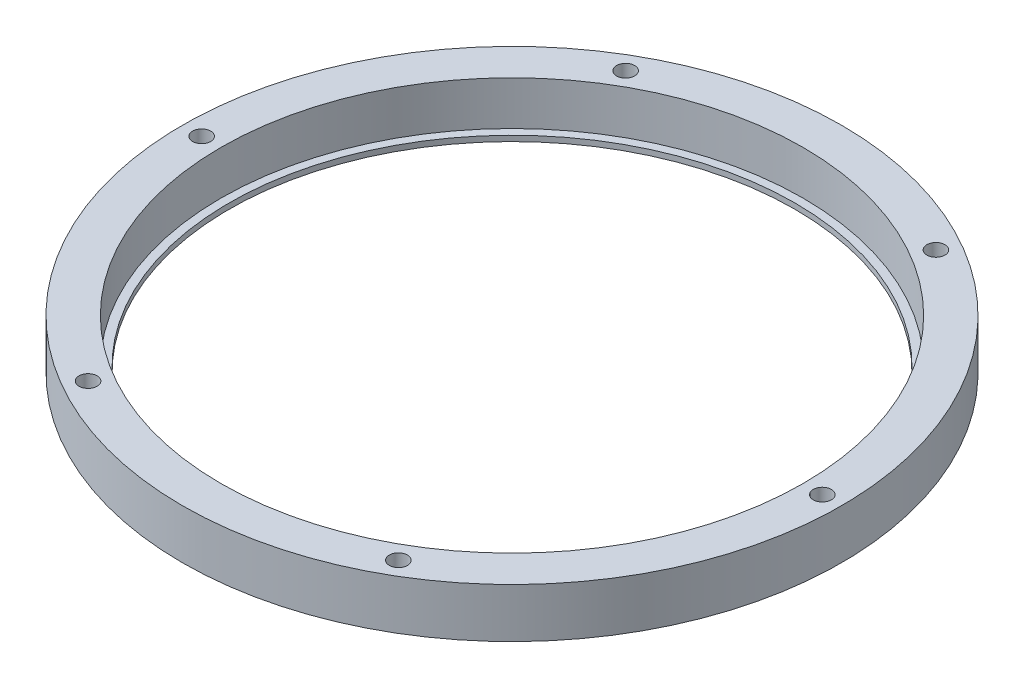
ISO-10303-21;
HEADER;
FILE_DESCRIPTION(('STEP AP214'),'2;1');
FILE_NAME('part.step','',(''),(''),'','','');
FILE_SCHEMA(('AUTOMOTIVE_DESIGN { 1 0 10303 214 1 1 1 1 }'));
ENDSEC;
DATA;
#1=APPLICATION_CONTEXT('core data for automotive mechanical design processes');
#2=APPLICATION_PROTOCOL_DEFINITION('international standard','automotive_design',2000,#1);
#3=PRODUCT_CONTEXT('',#1,'mechanical');
#4=PRODUCT('Part','Part','',(#3));
#5=PRODUCT_RELATED_PRODUCT_CATEGORY('part','',(#4));
#6=PRODUCT_DEFINITION_FORMATION('','',#4);
#7=PRODUCT_DEFINITION_CONTEXT('part definition',#1,'design');
#8=PRODUCT_DEFINITION('design','',#6,#7);
#9=PRODUCT_DEFINITION_SHAPE('','',#8);
#10=(LENGTH_UNIT() NAMED_UNIT(*) SI_UNIT(.MILLI.,.METRE.));
#11=(NAMED_UNIT(*) PLANE_ANGLE_UNIT() SI_UNIT($,.RADIAN.));
#12=(NAMED_UNIT(*) SI_UNIT($,.STERADIAN.) SOLID_ANGLE_UNIT());
#13=UNCERTAINTY_MEASURE_WITH_UNIT(LENGTH_MEASURE(1.E-05),#10,'distance_accuracy_value','');
#14=(GEOMETRIC_REPRESENTATION_CONTEXT(3) GLOBAL_UNCERTAINTY_ASSIGNED_CONTEXT((#13)) GLOBAL_UNIT_ASSIGNED_CONTEXT((#10,
#11,#12)) REPRESENTATION_CONTEXT('',''));
#15=CARTESIAN_POINT('',(0.,0.,0.));
#16=DIRECTION('',(0.,0.,1.));
#17=DIRECTION('',(1.,0.,0.));
#18=AXIS2_PLACEMENT_3D('',#15,#16,#17);
#19=CARTESIAN_POINT('',(0.,8.,0.));
#20=DIRECTION('',(0.,1.,0.));
#21=DIRECTION('',(0.,0.,1.));
#22=AXIS2_PLACEMENT_3D('',#19,#20,#21);
#23=PLANE('',#22);
#24=CARTESIAN_POINT('',(-28.25,8.,-48.9304353138208));
#25=DIRECTION('',(0.,1.,0.));
#26=DIRECTION('',(0.,0.,1.));
#27=AXIS2_PLACEMENT_3D('',#24,#25,#26);
#28=CIRCLE('',#27,1.64999999999999);
#29=CARTESIAN_POINT('',(-28.25,8.,-47.2804353138208));
#30=VERTEX_POINT('',#29);
#31=EDGE_CURVE('E93',#30,#30,#28,.T.);
#32=ORIENTED_EDGE('',*,*,#31,.F.);
#33=EDGE_LOOP('',(#32));
#34=FACE_BOUND('',#33,.T.);
#35=CARTESIAN_POINT('',(28.25,8.,-48.9304353138208));
#36=DIRECTION('',(0.,1.,0.));
#37=DIRECTION('',(0.,0.,1.));
#38=AXIS2_PLACEMENT_3D('',#35,#36,#37);
#39=CIRCLE('',#38,1.64999999999999);
#40=CARTESIAN_POINT('',(28.25,8.,-47.2804353138208));
#41=VERTEX_POINT('',#40);
#42=EDGE_CURVE('E87',#41,#41,#39,.T.);
#43=ORIENTED_EDGE('',*,*,#42,.F.);
#44=EDGE_LOOP('',(#43));
#45=FACE_BOUND('',#44,.T.);
#46=CARTESIAN_POINT('',(56.5,8.,0.));
#47=DIRECTION('',(0.,1.,0.));
#48=DIRECTION('',(0.,0.,1.));
#49=AXIS2_PLACEMENT_3D('',#46,#47,#48);
#50=CIRCLE('',#49,1.64999999999998);
#51=CARTESIAN_POINT('',(56.5,8.,1.64999999999998));
#52=VERTEX_POINT('',#51);
#53=EDGE_CURVE('E81',#52,#52,#50,.T.);
#54=ORIENTED_EDGE('',*,*,#53,.F.);
#55=EDGE_LOOP('',(#54));
#56=FACE_BOUND('',#55,.T.);
#57=CARTESIAN_POINT('',(28.25,8.,48.9304353138208));
#58=DIRECTION('',(0.,1.,0.));
#59=DIRECTION('',(0.,0.,1.));
#60=AXIS2_PLACEMENT_3D('',#57,#58,#59);
#61=CIRCLE('',#60,1.64999999999999);
#62=CARTESIAN_POINT('',(28.25,8.,50.5804353138208));
#63=VERTEX_POINT('',#62);
#64=EDGE_CURVE('E75',#63,#63,#61,.T.);
#65=ORIENTED_EDGE('',*,*,#64,.F.);
#66=EDGE_LOOP('',(#65));
#67=FACE_BOUND('',#66,.T.);
#68=CARTESIAN_POINT('',(-28.25,8.,48.9304353138208));
#69=DIRECTION('',(0.,1.,0.));
#70=DIRECTION('',(0.,0.,1.));
#71=AXIS2_PLACEMENT_3D('',#68,#69,#70);
#72=CIRCLE('',#71,1.64999999999999);
#73=CARTESIAN_POINT('',(-28.25,8.,50.5804353138208));
#74=VERTEX_POINT('',#73);
#75=EDGE_CURVE('E69',#74,#74,#72,.T.);
#76=ORIENTED_EDGE('',*,*,#75,.F.);
#77=EDGE_LOOP('',(#76));
#78=FACE_BOUND('',#77,.T.);
#79=CARTESIAN_POINT('',(-56.5,8.,0.));
#80=DIRECTION('',(0.,1.,0.));
#81=DIRECTION('',(0.,0.,1.));
#82=AXIS2_PLACEMENT_3D('',#79,#80,#81);
#83=CIRCLE('',#82,1.64999999999998);
#84=CARTESIAN_POINT('',(-56.5,8.,1.64999999999997));
#85=VERTEX_POINT('',#84);
#86=EDGE_CURVE('E63',#85,#85,#83,.T.);
#87=ORIENTED_EDGE('',*,*,#86,.F.);
#88=EDGE_LOOP('',(#87));
#89=FACE_BOUND('',#88,.T.);
#90=CARTESIAN_POINT('',(0.,8.,0.));
#91=DIRECTION('',(0.,1.,0.));
#92=DIRECTION('',(0.,0.,1.));
#93=AXIS2_PLACEMENT_3D('',#90,#91,#92);
#94=CIRCLE('',#93,60.);
#95=CARTESIAN_POINT('',(0.,8.,60.));
#96=VERTEX_POINT('',#95);
#97=EDGE_CURVE('E10',#96,#96,#94,.T.);
#98=ORIENTED_EDGE('',*,*,#97,.T.);
#99=EDGE_LOOP('',(#98));
#100=FACE_BOUND('',#99,.T.);
#101=CARTESIAN_POINT('',(0.,8.,0.));
#102=DIRECTION('',(0.,1.,0.));
#103=DIRECTION('',(0.,0.,1.));
#104=AXIS2_PLACEMENT_3D('',#101,#102,#103);
#105=CIRCLE('',#104,53.);
#106=CARTESIAN_POINT('',(0.,8.,53.));
#107=VERTEX_POINT('',#106);
#108=EDGE_CURVE('E41',#107,#107,#105,.T.);
#109=ORIENTED_EDGE('',*,*,#108,.F.);
#110=EDGE_LOOP('',(#109));
#111=FACE_BOUND('',#110,.T.);
#112=ADVANCED_FACE('F34',(#34,#45,#56,#67,#78,#89,#100,#111),#23,.T.);
#113=CARTESIAN_POINT('',(0.,8.,0.));
#114=DIRECTION('',(0.,-1.,0.));
#115=DIRECTION('',(0.,0.,-1.));
#116=AXIS2_PLACEMENT_3D('',#113,#114,#115);
#117=CYLINDRICAL_SURFACE('',#116,60.);
#118=ORIENTED_EDGE('',*,*,#97,.F.);
#119=EDGE_LOOP('',(#118));
#120=FACE_BOUND('',#119,.T.);
#121=CARTESIAN_POINT('',(0.,-1.,0.));
#122=DIRECTION('',(0.,-1.,0.));
#123=DIRECTION('',(0.,0.,-1.));
#124=AXIS2_PLACEMENT_3D('',#121,#122,#123);
#125=CIRCLE('',#124,60.);
#126=CARTESIAN_POINT('',(0.,-1.,-60.));
#127=VERTEX_POINT('',#126);
#128=EDGE_CURVE('E50',#127,#127,#125,.T.);
#129=ORIENTED_EDGE('',*,*,#128,.F.);
#130=EDGE_LOOP('',(#129));
#131=FACE_BOUND('',#130,.T.);
#132=ADVANCED_FACE('F36',(#120,#131),#117,.T.);
#133=CARTESIAN_POINT('',(0.,8.,0.));
#134=DIRECTION('',(0.,-1.,0.));
#135=DIRECTION('',(0.,0.,-1.));
#136=AXIS2_PLACEMENT_3D('',#133,#134,#135);
#137=CYLINDRICAL_SURFACE('',#136,53.);
#138=ORIENTED_EDGE('',*,*,#108,.T.);
#139=EDGE_LOOP('',(#138));
#140=FACE_BOUND('',#139,.T.);
#141=CARTESIAN_POINT('',(0.,0.,0.));
#142=DIRECTION('',(0.,1.,0.));
#143=DIRECTION('',(0.,0.,1.));
#144=AXIS2_PLACEMENT_3D('',#141,#142,#143);
#145=CIRCLE('',#144,53.);
#146=CARTESIAN_POINT('',(0.,0.,53.));
#147=VERTEX_POINT('',#146);
#148=EDGE_CURVE('E45',#147,#147,#145,.T.);
#149=ORIENTED_EDGE('',*,*,#148,.F.);
#150=EDGE_LOOP('',(#149));
#151=FACE_BOUND('',#150,.T.);
#152=ADVANCED_FACE('F137',(#140,#151),#137,.F.);
#153=CARTESIAN_POINT('',(0.,0.,0.));
#154=DIRECTION('',(0.,-1.,0.));
#155=DIRECTION('',(0.,0.,-1.));
#156=AXIS2_PLACEMENT_3D('',#153,#154,#155);
#157=PLANE('',#156);
#158=CARTESIAN_POINT('',(0.,0.,0.));
#159=DIRECTION('',(0.,-1.,0.));
#160=DIRECTION('',(0.,0.,-1.));
#161=AXIS2_PLACEMENT_3D('',#158,#159,#160);
#162=CIRCLE('',#161,51.5);
#163=CARTESIAN_POINT('',(0.,0.,-51.5));
#164=VERTEX_POINT('',#163);
#165=EDGE_CURVE('E55',#164,#164,#162,.T.);
#166=ORIENTED_EDGE('',*,*,#165,.T.);
#167=EDGE_LOOP('',(#166));
#168=FACE_BOUND('',#167,.T.);
#169=ORIENTED_EDGE('',*,*,#148,.T.);
#170=EDGE_LOOP('',(#169));
#171=FACE_BOUND('',#170,.T.);
#172=ADVANCED_FACE('F133',(#168,#171),#157,.F.);
#173=CARTESIAN_POINT('',(0.,-1.,0.));
#174=DIRECTION('',(0.,-1.,0.));
#175=DIRECTION('',(0.,0.,-1.));
#176=AXIS2_PLACEMENT_3D('',#173,#174,#175);
#177=PLANE('',#176);
#178=CARTESIAN_POINT('',(-28.25,-1.,-48.9304353138208));
#179=DIRECTION('',(0.,1.,0.));
#180=DIRECTION('',(0.,0.,1.));
#181=AXIS2_PLACEMENT_3D('',#178,#179,#180);
#182=CIRCLE('',#181,1.65);
#183=CARTESIAN_POINT('',(-28.25,-1.,-47.2804353138208));
#184=VERTEX_POINT('',#183);
#185=EDGE_CURVE('E90',#184,#184,#182,.T.);
#186=ORIENTED_EDGE('',*,*,#185,.T.);
#187=EDGE_LOOP('',(#186));
#188=FACE_BOUND('',#187,.T.);
#189=CARTESIAN_POINT('',(28.25,-1.,-48.9304353138208));
#190=DIRECTION('',(0.,1.,0.));
#191=DIRECTION('',(0.,0.,1.));
#192=AXIS2_PLACEMENT_3D('',#189,#190,#191);
#193=CIRCLE('',#192,1.65);
#194=CARTESIAN_POINT('',(28.25,-1.,-47.2804353138208));
#195=VERTEX_POINT('',#194);
#196=EDGE_CURVE('E84',#195,#195,#193,.T.);
#197=ORIENTED_EDGE('',*,*,#196,.T.);
#198=EDGE_LOOP('',(#197));
#199=FACE_BOUND('',#198,.T.);
#200=CARTESIAN_POINT('',(56.5,-1.,0.));
#201=DIRECTION('',(0.,1.,0.));
#202=DIRECTION('',(0.,0.,1.));
#203=AXIS2_PLACEMENT_3D('',#200,#201,#202);
#204=CIRCLE('',#203,1.65);
#205=CARTESIAN_POINT('',(56.5,-1.,1.65));
#206=VERTEX_POINT('',#205);
#207=EDGE_CURVE('E78',#206,#206,#204,.T.);
#208=ORIENTED_EDGE('',*,*,#207,.T.);
#209=EDGE_LOOP('',(#208));
#210=FACE_BOUND('',#209,.T.);
#211=CARTESIAN_POINT('',(28.25,-1.,48.9304353138208));
#212=DIRECTION('',(0.,1.,0.));
#213=DIRECTION('',(0.,0.,1.));
#214=AXIS2_PLACEMENT_3D('',#211,#212,#213);
#215=CIRCLE('',#214,1.65);
#216=CARTESIAN_POINT('',(28.25,-1.,50.5804353138208));
#217=VERTEX_POINT('',#216);
#218=EDGE_CURVE('E72',#217,#217,#215,.T.);
#219=ORIENTED_EDGE('',*,*,#218,.T.);
#220=EDGE_LOOP('',(#219));
#221=FACE_BOUND('',#220,.T.);
#222=CARTESIAN_POINT('',(-28.25,-1.,48.9304353138208));
#223=DIRECTION('',(0.,1.,0.));
#224=DIRECTION('',(0.,0.,1.));
#225=AXIS2_PLACEMENT_3D('',#222,#223,#224);
#226=CIRCLE('',#225,1.65);
#227=CARTESIAN_POINT('',(-28.25,-1.,50.5804353138208));
#228=VERTEX_POINT('',#227);
#229=EDGE_CURVE('E66',#228,#228,#226,.T.);
#230=ORIENTED_EDGE('',*,*,#229,.T.);
#231=EDGE_LOOP('',(#230));
#232=FACE_BOUND('',#231,.T.);
#233=CARTESIAN_POINT('',(-56.5,-1.,0.));
#234=DIRECTION('',(0.,1.,0.));
#235=DIRECTION('',(0.,0.,1.));
#236=AXIS2_PLACEMENT_3D('',#233,#234,#235);
#237=CIRCLE('',#236,1.65);
#238=CARTESIAN_POINT('',(-56.5,-1.,1.64999999999998));
#239=VERTEX_POINT('',#238);
#240=EDGE_CURVE('E58',#239,#239,#237,.T.);
#241=ORIENTED_EDGE('',*,*,#240,.T.);
#242=EDGE_LOOP('',(#241));
#243=FACE_BOUND('',#242,.T.);
#244=ORIENTED_EDGE('',*,*,#128,.T.);
#245=EDGE_LOOP('',(#244));
#246=FACE_BOUND('',#245,.T.);
#247=CARTESIAN_POINT('',(0.,-1.,0.));
#248=DIRECTION('',(0.,-1.,0.));
#249=DIRECTION('',(0.,0.,-1.));
#250=AXIS2_PLACEMENT_3D('',#247,#248,#249);
#251=CIRCLE('',#250,51.5);
#252=CARTESIAN_POINT('',(0.,-1.,-51.5));
#253=VERTEX_POINT('',#252);
#254=EDGE_CURVE('E54',#253,#253,#251,.T.);
#255=ORIENTED_EDGE('',*,*,#254,.F.);
#256=EDGE_LOOP('',(#255));
#257=FACE_BOUND('',#256,.T.);
#258=ADVANCED_FACE('F125',(#188,#199,#210,#221,#232,#243,#246,#257),#177,.T.);
#259=CARTESIAN_POINT('',(0.,-1.,0.));
#260=DIRECTION('',(0.,1.,0.));
#261=DIRECTION('',(0.,0.,1.));
#262=AXIS2_PLACEMENT_3D('',#259,#260,#261);
#263=CYLINDRICAL_SURFACE('',#262,51.5);
#264=ORIENTED_EDGE('',*,*,#254,.T.);
#265=EDGE_LOOP('',(#264));
#266=FACE_BOUND('',#265,.T.);
#267=ORIENTED_EDGE('',*,*,#165,.F.);
#268=EDGE_LOOP('',(#267));
#269=FACE_BOUND('',#268,.T.);
#270=ADVANCED_FACE('F115',(#266,#269),#263,.F.);
#271=CARTESIAN_POINT('',(-56.5,8.,0.));
#272=DIRECTION('',(0.,1.,0.));
#273=DIRECTION('',(0.,0.,1.));
#274=AXIS2_PLACEMENT_3D('',#271,#272,#273);
#275=CYLINDRICAL_SURFACE('',#274,1.64999999999999);
#276=ORIENTED_EDGE('',*,*,#240,.F.);
#277=EDGE_LOOP('',(#276));
#278=FACE_BOUND('',#277,.T.);
#279=ORIENTED_EDGE('',*,*,#86,.T.);
#280=EDGE_LOOP('',(#279));
#281=FACE_BOUND('',#280,.T.);
#282=ADVANCED_FACE('F112',(#278,#281),#275,.F.);
#283=CARTESIAN_POINT('',(-28.25,8.,48.9304353138208));
#284=DIRECTION('',(0.,1.,0.));
#285=DIRECTION('',(0.,0.,1.));
#286=AXIS2_PLACEMENT_3D('',#283,#284,#285);
#287=CYLINDRICAL_SURFACE('',#286,1.64999999999999);
#288=ORIENTED_EDGE('',*,*,#229,.F.);
#289=EDGE_LOOP('',(#288));
#290=FACE_BOUND('',#289,.T.);
#291=ORIENTED_EDGE('',*,*,#75,.T.);
#292=EDGE_LOOP('',(#291));
#293=FACE_BOUND('',#292,.T.);
#294=ADVANCED_FACE('F114',(#290,#293),#287,.F.);
#295=CARTESIAN_POINT('',(28.25,8.,48.9304353138208));
#296=DIRECTION('',(0.,1.,0.));
#297=DIRECTION('',(0.,0.,1.));
#298=AXIS2_PLACEMENT_3D('',#295,#296,#297);
#299=CYLINDRICAL_SURFACE('',#298,1.64999999999999);
#300=ORIENTED_EDGE('',*,*,#218,.F.);
#301=EDGE_LOOP('',(#300));
#302=FACE_BOUND('',#301,.T.);
#303=ORIENTED_EDGE('',*,*,#64,.T.);
#304=EDGE_LOOP('',(#303));
#305=FACE_BOUND('',#304,.T.);
#306=ADVANCED_FACE('F122',(#302,#305),#299,.F.);
#307=CARTESIAN_POINT('',(56.5,8.,0.));
#308=DIRECTION('',(0.,1.,0.));
#309=DIRECTION('',(0.,0.,1.));
#310=AXIS2_PLACEMENT_3D('',#307,#308,#309);
#311=CYLINDRICAL_SURFACE('',#310,1.64999999999999);
#312=ORIENTED_EDGE('',*,*,#207,.F.);
#313=EDGE_LOOP('',(#312));
#314=FACE_BOUND('',#313,.T.);
#315=ORIENTED_EDGE('',*,*,#53,.T.);
#316=EDGE_LOOP('',(#315));
#317=FACE_BOUND('',#316,.T.);
#318=ADVANCED_FACE('F196',(#314,#317),#311,.F.);
#319=CARTESIAN_POINT('',(28.25,8.,-48.9304353138208));
#320=DIRECTION('',(0.,1.,0.));
#321=DIRECTION('',(0.,0.,1.));
#322=AXIS2_PLACEMENT_3D('',#319,#320,#321);
#323=CYLINDRICAL_SURFACE('',#322,1.64999999999999);
#324=ORIENTED_EDGE('',*,*,#196,.F.);
#325=EDGE_LOOP('',(#324));
#326=FACE_BOUND('',#325,.T.);
#327=ORIENTED_EDGE('',*,*,#42,.T.);
#328=EDGE_LOOP('',(#327));
#329=FACE_BOUND('',#328,.T.);
#330=ADVANCED_FACE('F206',(#326,#329),#323,.F.);
#331=CARTESIAN_POINT('',(-28.25,8.,-48.9304353138208));
#332=DIRECTION('',(0.,1.,0.));
#333=DIRECTION('',(0.,0.,1.));
#334=AXIS2_PLACEMENT_3D('',#331,#332,#333);
#335=CYLINDRICAL_SURFACE('',#334,1.64999999999999);
#336=ORIENTED_EDGE('',*,*,#185,.F.);
#337=EDGE_LOOP('',(#336));
#338=FACE_BOUND('',#337,.T.);
#339=ORIENTED_EDGE('',*,*,#31,.T.);
#340=EDGE_LOOP('',(#339));
#341=FACE_BOUND('',#340,.T.);
#342=ADVANCED_FACE('F97',(#338,#341),#335,.F.);
#343=CLOSED_SHELL('',(#112,#132,#152,#172,#258,#270,#282,#294,#306,#318,#330,#342));
#344=MANIFOLD_SOLID_BREP('B2',#343);
#345=ADVANCED_BREP_SHAPE_REPRESENTATION('',(#18,#344),#14);
#346=SHAPE_DEFINITION_REPRESENTATION(#9,#345);
ENDSEC;
END-ISO-10303-21;
